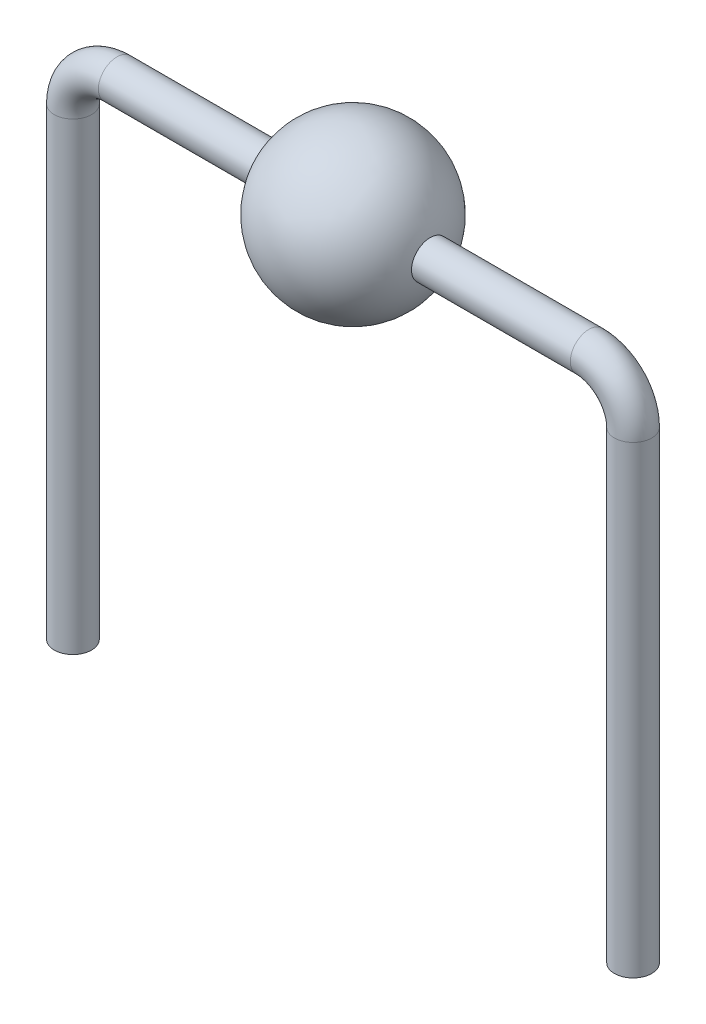
ISO-10303-21;
HEADER;
FILE_DESCRIPTION(('STEP AP214'),'2;1');
FILE_NAME('part.step','',(''),(''),'','','');
FILE_SCHEMA(('AUTOMOTIVE_DESIGN { 1 0 10303 214 1 1 1 1 }'));
ENDSEC;
DATA;
#1=APPLICATION_CONTEXT('core data for automotive mechanical design processes');
#2=APPLICATION_PROTOCOL_DEFINITION('international standard','automotive_design',2000,#1);
#3=PRODUCT_CONTEXT('',#1,'mechanical');
#4=PRODUCT('Part','Part','',(#3));
#5=PRODUCT_RELATED_PRODUCT_CATEGORY('part','',(#4));
#6=PRODUCT_DEFINITION_FORMATION('','',#4);
#7=PRODUCT_DEFINITION_CONTEXT('part definition',#1,'design');
#8=PRODUCT_DEFINITION('design','',#6,#7);
#9=PRODUCT_DEFINITION_SHAPE('','',#8);
#10=(LENGTH_UNIT() NAMED_UNIT(*) SI_UNIT(.MILLI.,.METRE.));
#11=(NAMED_UNIT(*) PLANE_ANGLE_UNIT() SI_UNIT($,.RADIAN.));
#12=(NAMED_UNIT(*) SI_UNIT($,.STERADIAN.) SOLID_ANGLE_UNIT());
#13=UNCERTAINTY_MEASURE_WITH_UNIT(LENGTH_MEASURE(1.E-05),#10,'distance_accuracy_value','');
#14=(GEOMETRIC_REPRESENTATION_CONTEXT(3) GLOBAL_UNCERTAINTY_ASSIGNED_CONTEXT((#13)) GLOBAL_UNIT_ASSIGNED_CONTEXT((#10,
#11,#12)) REPRESENTATION_CONTEXT('',''));
#15=CARTESIAN_POINT('',(0.,0.,0.));
#16=DIRECTION('',(0.,0.,1.));
#17=DIRECTION('',(1.,0.,0.));
#18=AXIS2_PLACEMENT_3D('',#15,#16,#17);
#19=CARTESIAN_POINT('',(0.,0.,0.));
#20=DIRECTION('',(-1.,0.,0.));
#21=DIRECTION('',(0.,0.,-1.));
#22=AXIS2_PLACEMENT_3D('',#19,#20,#21);
#23=SPHERICAL_SURFACE('',#22,1.8);
#24=CARTESIAN_POINT('',(1.74957838479418,0.,0.));
#25=DIRECTION('',(1.,0.,0.));
#26=DIRECTION('',(0.,0.,-1.));
#27=AXIS2_PLACEMENT_3D('',#24,#25,#26);
#28=CIRCLE('',#27,0.423054931966296);
#29=CARTESIAN_POINT('',(1.74957838479418,0.,-0.423054931966293));
#30=VERTEX_POINT('',#29);
#31=EDGE_CURVE('E60',#30,#30,#28,.T.);
#32=CARTESIAN_POINT('',(-1.74957838479417,0.,0.));
#33=DIRECTION('',(-1.,0.,0.));
#34=DIRECTION('',(0.,0.,1.));
#35=AXIS2_PLACEMENT_3D('',#32,#33,#34);
#36=CIRCLE('',#35,0.423054931966296);
#37=CARTESIAN_POINT('',(-1.74957838479417,0.,-0.423054931966299));
#38=VERTEX_POINT('',#37);
#39=EDGE_CURVE('E10',#38,#38,#36,.T.);
#40=CARTESIAN_POINT('',(1.74957838479418,0.,-0.423054931966293));
#41=CARTESIAN_POINT('',(1.73782991848519,0.,-0.471663721621431));
#42=CARTESIAN_POINT('',(1.72404611129111,0.,-0.519779586599976));
#43=CARTESIAN_POINT('',(1.69252515765866,0.,-0.614698603665012));
#44=CARTESIAN_POINT('',(1.67478801122029,0.,-0.661501755751503));
#45=CARTESIAN_POINT('',(1.63547772162515,0.,-0.753468483493565));
#46=CARTESIAN_POINT('',(1.61390457846839,0.,-0.798632059149136));
#47=CARTESIAN_POINT('',(1.56707362421985,0.,-0.887006595492568));
#48=CARTESIAN_POINT('',(1.54181581312808,0.,-0.930217556180428));
#49=CARTESIAN_POINT('',(1.48779046254893,0.,-1.01438672602675));
#50=CARTESIAN_POINT('',(1.45902292306155,0.,-1.05534493518521));
#51=CARTESIAN_POINT('',(1.39817795003781,0.,-1.13472428078953));
#52=CARTESIAN_POINT('',(1.36610051650144,0.,-1.17314541723539));
#53=CARTESIAN_POINT('',(1.2988584276587,0.,-1.24718386324296));
#54=CARTESIAN_POINT('',(1.26369377235233,0.,-1.28280117280468));
#55=CARTESIAN_POINT('',(1.19052138363775,0.,-1.35098468943025));
#56=CARTESIAN_POINT('',(1.15251365022953,0.,-1.3835508964941));
#57=CARTESIAN_POINT('',(1.0739189772985,0.,-1.44540611185343));
#58=CARTESIAN_POINT('',(1.03333203777569,0.,-1.47469512014891));
#59=CARTESIAN_POINT('',(0.949860733832475,0.,-1.52979259502669));
#60=CARTESIAN_POINT('',(0.906976369412065,0.,-1.55560106160898));
#61=CARTESIAN_POINT('',(0.819207946362786,0.,-1.60355827403284));
#62=CARTESIAN_POINT('',(0.774323887733917,0.,-1.62570701987441));
#63=CARTESIAN_POINT('',(0.682867690315786,0.,-1.66619101998967));
#64=CARTESIAN_POINT('',(0.636295551526523,0.,-1.68452627426337));
#65=CARTESIAN_POINT('',(0.54178652752164,0.,-1.71725599610985));
#66=CARTESIAN_POINT('',(0.493849642306019,0.,-1.73165046368264));
#67=CARTESIAN_POINT('',(0.396943934144056,0.,-1.75639867647512));
#68=CARTESIAN_POINT('',(0.347975111197713,0.,-1.76675242169483));
#69=CARTESIAN_POINT('',(0.249345500641702,0.,-1.7833473074215));
#70=CARTESIAN_POINT('',(0.199684713032035,0.,-1.78958844792847));
#71=CARTESIAN_POINT('',(0.10001595028158,0.,-1.79791479421772));
#72=CARTESIAN_POINT('',(0.0500079751407916,0.,-1.8));
#73=CARTESIAN_POINT('',(-0.0500079751407854,0.,-1.8));
#74=CARTESIAN_POINT('',(-0.100015950281574,0.,-1.79791479421772));
#75=CARTESIAN_POINT('',(-0.199684713032029,0.,-1.78958844792847));
#76=CARTESIAN_POINT('',(-0.249345500641696,0.,-1.7833473074215));
#77=CARTESIAN_POINT('',(-0.347975111197706,0.,-1.76675242169483));
#78=CARTESIAN_POINT('',(-0.39694393414405,0.,-1.75639867647513));
#79=CARTESIAN_POINT('',(-0.493849642306013,0.,-1.73165046368264));
#80=CARTESIAN_POINT('',(-0.541786527521634,0.,-1.71725599610985));
#81=CARTESIAN_POINT('',(-0.636295551526517,0.,-1.68452627426337));
#82=CARTESIAN_POINT('',(-0.68286769031578,0.,-1.66619101998968));
#83=CARTESIAN_POINT('',(-0.774323887733912,0.,-1.62570701987442));
#84=CARTESIAN_POINT('',(-0.81920794636278,0.,-1.60355827403285));
#85=CARTESIAN_POINT('',(-0.906976369412059,0.,-1.55560106160899));
#86=CARTESIAN_POINT('',(-0.94986073383247,0.,-1.52979259502669));
#87=CARTESIAN_POINT('',(-1.03333203777569,0.,-1.47469512014892));
#88=CARTESIAN_POINT('',(-1.0739189772985,0.,-1.44540611185344));
#89=CARTESIAN_POINT('',(-1.15251365022952,0.,-1.38355089649411));
#90=CARTESIAN_POINT('',(-1.19052138363774,0.,-1.35098468943025));
#91=CARTESIAN_POINT('',(-1.26369377235233,0.,-1.28280117280468));
#92=CARTESIAN_POINT('',(-1.2988584276587,0.,-1.24718386324297));
#93=CARTESIAN_POINT('',(-1.36610051650144,0.,-1.17314541723539));
#94=CARTESIAN_POINT('',(-1.39817795003781,0.,-1.13472428078954));
#95=CARTESIAN_POINT('',(-1.45902292306155,0.,-1.05534493518522));
#96=CARTESIAN_POINT('',(-1.48779046254893,0.,-1.01438672602676));
#97=CARTESIAN_POINT('',(-1.54181581312807,0.,-0.930217556180433));
#98=CARTESIAN_POINT('',(-1.56707362421985,0.,-0.887006595492573));
#99=CARTESIAN_POINT('',(-1.61390457846839,0.,-0.798632059149142));
#100=CARTESIAN_POINT('',(-1.63547772162515,0.,-0.753468483493571));
#101=CARTESIAN_POINT('',(-1.67478801122029,0.,-0.661501755751509));
#102=CARTESIAN_POINT('',(-1.69252515765866,0.,-0.614698603665018));
#103=CARTESIAN_POINT('',(-1.72404611129111,0.,-0.519779586599982));
#104=CARTESIAN_POINT('',(-1.73782991848519,0.,-0.471663721621437));
#105=CARTESIAN_POINT('',(-1.74957838479417,0.,-0.423054931966299));
#106=B_SPLINE_CURVE_WITH_KNOTS('',3,(#40,#41,#42,#43,#44,#45,#46,#47,#48,#49,#50,#51,#52,#53,
#54,#55,#56,#57,#58,#59,#60,#61,#62,#63,#64,#65,#66,#67,#68,#69,#70,#71,#72,#73,#74,#75,#76,#77,
#78,#79,#80,#81,#82,#83,#84,#85,#86,#87,#88,#89,#90,#91,#92,#93,#94,#95,#96,#97,#98,#99,#100,
#101,#102,#103,#104,#105),.UNSPECIFIED.,.F.,.F.,(4,2,2,2,2,2,2,2,2,2,2,2,2,2,2,2,2,2,2,2,2,2,2,
2,2,2,2,2,2,2,2,2,4),(0.,0.14998054586135,0.299961091722701,0.449941637584051,0.599922183445401,
0.749902729306752,0.899883275168102,1.04986382102945,1.1998443668908,1.34982491275215,
1.4998054586135,1.64978600447485,1.7997665503362,1.94974709619755,2.09972764205891,
2.24970818792026,2.39968873378161,2.54966927964296,2.69964982550431,2.84963037136566,
2.99961091722701,3.14959146308836,3.29957200894971,3.44955255481106,3.59953310067241,
3.74951364653376,3.89949419239511,4.04947473825646,4.19945528411781,4.34943582997916,
4.49941637584051,4.64939692170186,4.79937746756321),.UNSPECIFIED.);
#107=EDGE_CURVE('BSEAM34',#30,#38,#106,.T.);
#108=ORIENTED_EDGE('',*,*,#31,.F.);
#109=ORIENTED_EDGE('',*,*,#39,.F.);
#110=ORIENTED_EDGE('',*,*,#107,.T.);
#111=ORIENTED_EDGE('',*,*,#107,.F.);
#112=EDGE_LOOP('',(#108,#110,#109,#111));
#113=FACE_BOUND('',#112,.T.);
#114=ADVANCED_FACE('F34',(#113),#23,.T.);
#115=CARTESIAN_POINT('',(-6.35,-1.,0.));
#116=DIRECTION('',(0.,-1.,0.));
#117=DIRECTION('',(1.,0.,0.));
#118=AXIS2_PLACEMENT_3D('',#115,#116,#117);
#119=CYLINDRICAL_SURFACE('',#118,0.423054931966297);
#120=CARTESIAN_POINT('',(-6.35,-1.,0.));
#121=DIRECTION('',(0.,-1.,0.));
#122=DIRECTION('',(0.,0.,1.));
#123=AXIS2_PLACEMENT_3D('',#120,#121,#122);
#124=CIRCLE('',#123,0.423054931966297);
#125=CARTESIAN_POINT('',(-6.7730549319663,-1.,0.));
#126=VERTEX_POINT('',#125);
#127=EDGE_CURVE('E44',#126,#126,#124,.T.);
#128=ORIENTED_EDGE('',*,*,#127,.T.);
#129=EDGE_LOOP('',(#128));
#130=FACE_BOUND('',#129,.T.);
#131=CARTESIAN_POINT('',(-6.35,-11.514871197813,0.));
#132=DIRECTION('',(0.,-1.,0.));
#133=DIRECTION('',(0.,0.,1.));
#134=AXIS2_PLACEMENT_3D('',#131,#132,#133);
#135=CIRCLE('',#134,0.423054931966297);
#136=CARTESIAN_POINT('',(-6.35,-11.514871197813,0.423054931966297));
#137=VERTEX_POINT('',#136);
#138=EDGE_CURVE('E40',#137,#137,#135,.T.);
#139=ORIENTED_EDGE('',*,*,#138,.F.);
#140=EDGE_LOOP('',(#139));
#141=FACE_BOUND('',#140,.T.);
#142=ADVANCED_FACE('F78',(#130,#141),#119,.T.);
#143=CARTESIAN_POINT('',(-5.35,-1.,0.));
#144=DIRECTION('',(0.,0.,1.));
#145=DIRECTION('',(1.,0.,0.));
#146=AXIS2_PLACEMENT_3D('',#143,#144,#145);
#147=TOROIDAL_SURFACE('',#146,1.,0.423054931966297);
#148=CARTESIAN_POINT('',(-5.35,0.,0.));
#149=DIRECTION('',(-1.,0.,0.));
#150=DIRECTION('',(0.,0.,1.));
#151=AXIS2_PLACEMENT_3D('',#148,#149,#150);
#152=CIRCLE('',#151,0.423054931966297);
#153=CARTESIAN_POINT('',(-5.35,0.423054931966297,0.));
#154=VERTEX_POINT('',#153);
#155=EDGE_CURVE('E48',#154,#154,#152,.T.);
#156=CARTESIAN_POINT('',(-5.35,-1.,0.));
#157=DIRECTION('',(0.,0.,1.));
#158=DIRECTION('',(1.,0.,0.));
#159=AXIS2_PLACEMENT_3D('',#156,#157,#158);
#160=CIRCLE('',#159,1.4230549319663);
#161=EDGE_CURVE('',#154,#126,#160,.T.);
#162=ORIENTED_EDGE('',*,*,#155,.T.);
#163=ORIENTED_EDGE('',*,*,#127,.F.);
#164=ORIENTED_EDGE('',*,*,#161,.T.);
#165=ORIENTED_EDGE('',*,*,#161,.F.);
#166=EDGE_LOOP('',(#162,#164,#163,#165));
#167=FACE_BOUND('',#166,.T.);
#168=ADVANCED_FACE('F82',(#167),#147,.T.);
#169=CARTESIAN_POINT('',(-5.35,0.,0.));
#170=DIRECTION('',(1.,0.,0.));
#171=DIRECTION('',(0.,1.,0.));
#172=AXIS2_PLACEMENT_3D('',#169,#170,#171);
#173=CYLINDRICAL_SURFACE('',#172,0.423054931966297);
#174=ORIENTED_EDGE('',*,*,#155,.F.);
#175=EDGE_LOOP('',(#174));
#176=FACE_BOUND('',#175,.T.);
#177=ORIENTED_EDGE('',*,*,#39,.T.);
#178=EDGE_LOOP('',(#177));
#179=FACE_BOUND('',#178,.T.);
#180=ADVANCED_FACE('F87',(#176,#179),#173,.T.);
#181=CARTESIAN_POINT('',(-6.35,-11.514871197813,0.));
#182=DIRECTION('',(0.,-1.,0.));
#183=DIRECTION('',(0.,0.,1.));
#184=AXIS2_PLACEMENT_3D('',#181,#182,#183);
#185=PLANE('',#184);
#186=ORIENTED_EDGE('',*,*,#138,.T.);
#187=EDGE_LOOP('',(#186));
#188=FACE_BOUND('',#187,.T.);
#189=ADVANCED_FACE('F94',(#188),#185,.T.);
#190=CARTESIAN_POINT('',(6.35,-0.999999999999999,0.));
#191=DIRECTION('',(0.,-1.,0.));
#192=DIRECTION('',(0.,0.,-1.));
#193=AXIS2_PLACEMENT_3D('',#190,#191,#192);
#194=CYLINDRICAL_SURFACE('',#193,0.423054931966296);
#195=CARTESIAN_POINT('',(6.35,-0.999999999999999,0.));
#196=DIRECTION('',(0.,-1.,0.));
#197=DIRECTION('',(0.,0.,-1.));
#198=AXIS2_PLACEMENT_3D('',#195,#196,#197);
#199=CIRCLE('',#198,0.423054931966296);
#200=CARTESIAN_POINT('',(6.7730549319663,-0.999999999999999,0.));
#201=VERTEX_POINT('',#200);
#202=EDGE_CURVE('E56',#201,#201,#199,.T.);
#203=ORIENTED_EDGE('',*,*,#202,.T.);
#204=EDGE_LOOP('',(#203));
#205=FACE_BOUND('',#204,.T.);
#206=CARTESIAN_POINT('',(6.35,-11.5148711978129,0.));
#207=DIRECTION('',(0.,-1.,0.));
#208=DIRECTION('',(0.,0.,-1.));
#209=AXIS2_PLACEMENT_3D('',#206,#207,#208);
#210=CIRCLE('',#209,0.423054931966296);
#211=CARTESIAN_POINT('',(6.35,-11.5148711978129,-0.423054931966294));
#212=VERTEX_POINT('',#211);
#213=EDGE_CURVE('E53',#212,#212,#210,.T.);
#214=ORIENTED_EDGE('',*,*,#213,.F.);
#215=EDGE_LOOP('',(#214));
#216=FACE_BOUND('',#215,.T.);
#217=ADVANCED_FACE('F98',(#205,#216),#194,.T.);
#218=CARTESIAN_POINT('',(5.35,-1.,0.));
#219=DIRECTION('',(0.,0.,-1.));
#220=DIRECTION('',(-1.,0.,0.));
#221=AXIS2_PLACEMENT_3D('',#218,#219,#220);
#222=TOROIDAL_SURFACE('',#221,1.,0.423054931966296);
#223=CARTESIAN_POINT('',(5.35,0.,0.));
#224=DIRECTION('',(1.,0.,0.));
#225=DIRECTION('',(0.,0.,-1.));
#226=AXIS2_PLACEMENT_3D('',#223,#224,#225);
#227=CIRCLE('',#226,0.423054931966296);
#228=CARTESIAN_POINT('',(5.35,0.423054931966296,0.));
#229=VERTEX_POINT('',#228);
#230=EDGE_CURVE('E59',#229,#229,#227,.T.);
#231=CARTESIAN_POINT('',(5.35,-1.,0.));
#232=DIRECTION('',(0.,0.,-1.));
#233=DIRECTION('',(-1.,0.,0.));
#234=AXIS2_PLACEMENT_3D('',#231,#232,#233);
#235=CIRCLE('',#234,1.4230549319663);
#236=EDGE_CURVE('',#229,#201,#235,.T.);
#237=ORIENTED_EDGE('',*,*,#230,.T.);
#238=ORIENTED_EDGE('',*,*,#202,.F.);
#239=ORIENTED_EDGE('',*,*,#236,.T.);
#240=ORIENTED_EDGE('',*,*,#236,.F.);
#241=EDGE_LOOP('',(#237,#239,#238,#240));
#242=FACE_BOUND('',#241,.T.);
#243=ADVANCED_FACE('F66',(#242),#222,.T.);
#244=CARTESIAN_POINT('',(5.35,0.,0.));
#245=DIRECTION('',(-1.,0.,0.));
#246=DIRECTION('',(0.,-1.,0.));
#247=AXIS2_PLACEMENT_3D('',#244,#245,#246);
#248=CYLINDRICAL_SURFACE('',#247,0.423054931966296);
#249=ORIENTED_EDGE('',*,*,#230,.F.);
#250=EDGE_LOOP('',(#249));
#251=FACE_BOUND('',#250,.T.);
#252=ORIENTED_EDGE('',*,*,#31,.T.);
#253=EDGE_LOOP('',(#252));
#254=FACE_BOUND('',#253,.T.);
#255=ADVANCED_FACE('F69',(#251,#254),#248,.T.);
#256=CARTESIAN_POINT('',(6.35,-11.5148711978129,0.));
#257=DIRECTION('',(0.,-1.,0.));
#258=DIRECTION('',(0.,0.,-1.));
#259=AXIS2_PLACEMENT_3D('',#256,#257,#258);
#260=PLANE('',#259);
#261=ORIENTED_EDGE('',*,*,#213,.T.);
#262=EDGE_LOOP('',(#261));
#263=FACE_BOUND('',#262,.T.);
#264=ADVANCED_FACE('F72',(#263),#260,.T.);
#265=CLOSED_SHELL('',(#114,#142,#168,#180,#189,#217,#243,#255,#264));
#266=MANIFOLD_SOLID_BREP('B2',#265);
#267=ADVANCED_BREP_SHAPE_REPRESENTATION('',(#18,#266),#14);
#268=SHAPE_DEFINITION_REPRESENTATION(#9,#267);
ENDSEC;
END-ISO-10303-21;
